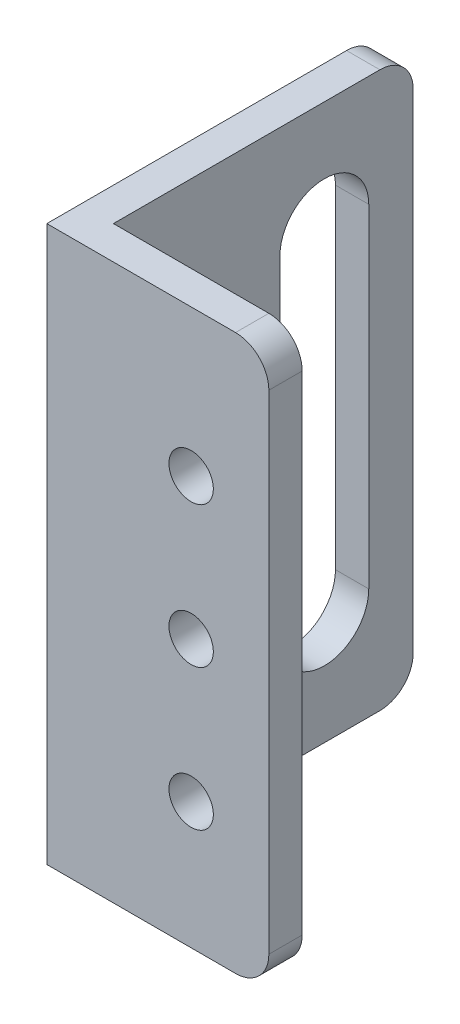
ISO-10303-21;
HEADER;
FILE_DESCRIPTION(('STEP AP214'),'2;1');
FILE_NAME('part.step','',(''),(''),'','','');
FILE_SCHEMA(('AUTOMOTIVE_DESIGN { 1 0 10303 214 1 1 1 1 }'));
ENDSEC;
DATA;
#1=APPLICATION_CONTEXT('core data for automotive mechanical design processes');
#2=APPLICATION_PROTOCOL_DEFINITION('international standard','automotive_design',2000,#1);
#3=PRODUCT_CONTEXT('',#1,'mechanical');
#4=PRODUCT('Part','Part','',(#3));
#5=PRODUCT_RELATED_PRODUCT_CATEGORY('part','',(#4));
#6=PRODUCT_DEFINITION_FORMATION('','',#4);
#7=PRODUCT_DEFINITION_CONTEXT('part definition',#1,'design');
#8=PRODUCT_DEFINITION('design','',#6,#7);
#9=PRODUCT_DEFINITION_SHAPE('','',#8);
#10=(LENGTH_UNIT() NAMED_UNIT(*) SI_UNIT(.MILLI.,.METRE.));
#11=(NAMED_UNIT(*) PLANE_ANGLE_UNIT() SI_UNIT($,.RADIAN.));
#12=(NAMED_UNIT(*) SI_UNIT($,.STERADIAN.) SOLID_ANGLE_UNIT());
#13=UNCERTAINTY_MEASURE_WITH_UNIT(LENGTH_MEASURE(1.E-05),#10,'distance_accuracy_value','');
#14=(GEOMETRIC_REPRESENTATION_CONTEXT(3) GLOBAL_UNCERTAINTY_ASSIGNED_CONTEXT((#13)) GLOBAL_UNIT_ASSIGNED_CONTEXT((#10,
#11,#12)) REPRESENTATION_CONTEXT('',''));
#15=CARTESIAN_POINT('',(0.,0.,0.));
#16=DIRECTION('',(0.,0.,1.));
#17=DIRECTION('',(1.,0.,0.));
#18=AXIS2_PLACEMENT_3D('',#15,#16,#17);
#19=CARTESIAN_POINT('',(-1.5,50.,0.));
#20=DIRECTION('',(1.,0.,0.));
#21=DIRECTION('',(0.,0.,-1.));
#22=AXIS2_PLACEMENT_3D('',#19,#20,#21);
#23=PLANE('',#22);
#24=DIRECTION('',(0.,-1.,0.));
#25=VECTOR('',#24,1.);
#26=CARTESIAN_POINT('',(-1.5,40.,-11.));
#27=LINE('',#26,#25);
#28=CARTESIAN_POINT('',(-1.5,40.,-11.));
#29=VERTEX_POINT('',#28);
#30=CARTESIAN_POINT('',(-1.5,10.,-11.));
#31=VERTEX_POINT('',#30);
#32=EDGE_CURVE('E159',#29,#31,#27,.T.);
#33=ORIENTED_EDGE('',*,*,#32,.F.);
#34=CARTESIAN_POINT('',(-1.5,40.,-7.));
#35=DIRECTION('',(-1.,0.,0.));
#36=DIRECTION('',(0.,0.,1.));
#37=AXIS2_PLACEMENT_3D('',#34,#35,#36);
#38=CIRCLE('',#37,4.);
#39=CARTESIAN_POINT('',(-1.5,40.,-3.));
#40=VERTEX_POINT('',#39);
#41=EDGE_CURVE('E164',#40,#29,#38,.T.);
#42=ORIENTED_EDGE('',*,*,#41,.F.);
#43=DIRECTION('',(0.,1.,0.));
#44=VECTOR('',#43,1.);
#45=CARTESIAN_POINT('',(-1.5,40.,-3.));
#46=LINE('',#45,#44);
#47=CARTESIAN_POINT('',(-1.5,10.,-3.));
#48=VERTEX_POINT('',#47);
#49=EDGE_CURVE('E167',#48,#40,#46,.T.);
#50=ORIENTED_EDGE('',*,*,#49,.F.);
#51=CARTESIAN_POINT('',(-1.5,10.,-7.));
#52=DIRECTION('',(-1.,0.,0.));
#53=DIRECTION('',(0.,0.,1.));
#54=AXIS2_PLACEMENT_3D('',#51,#52,#53);
#55=CIRCLE('',#54,4.);
#56=EDGE_CURVE('E148',#31,#48,#55,.T.);
#57=ORIENTED_EDGE('',*,*,#56,.F.);
#58=EDGE_LOOP('',(#33,#42,#50,#57));
#59=FACE_BOUND('',#58,.T.);
#60=DIRECTION('',(0.,0.,1.));
#61=VECTOR('',#60,1.);
#62=CARTESIAN_POINT('',(-1.5,50.,0.));
#63=LINE('',#62,#61);
#64=CARTESIAN_POINT('',(-1.5,50.,-12.));
#65=VERTEX_POINT('',#64);
#66=CARTESIAN_POINT('',(-1.5,50.,15.));
#67=VERTEX_POINT('',#66);
#68=EDGE_CURVE('E186',#65,#67,#63,.T.);
#69=ORIENTED_EDGE('',*,*,#68,.F.);
#70=CARTESIAN_POINT('',(-1.5,47.,-12.));
#71=DIRECTION('',(1.,0.,0.));
#72=DIRECTION('',(0.,0.,-1.));
#73=AXIS2_PLACEMENT_3D('',#70,#71,#72);
#74=CIRCLE('',#73,3.);
#75=CARTESIAN_POINT('',(-1.5,47.,-15.));
#76=VERTEX_POINT('',#75);
#77=EDGE_CURVE('E265',#65,#76,#74,.F.);
#78=ORIENTED_EDGE('',*,*,#77,.T.);
#79=DIRECTION('',(0.,-1.,0.));
#80=VECTOR('',#79,1.);
#81=CARTESIAN_POINT('',(-1.5,50.,-15.));
#82=LINE('',#81,#80);
#83=CARTESIAN_POINT('',(-1.5,3.,-15.));
#84=VERTEX_POINT('',#83);
#85=EDGE_CURVE('E197',#76,#84,#82,.T.);
#86=ORIENTED_EDGE('',*,*,#85,.T.);
#87=CARTESIAN_POINT('',(-1.5,3.,-12.));
#88=DIRECTION('',(1.,0.,0.));
#89=DIRECTION('',(0.,0.,-1.));
#90=AXIS2_PLACEMENT_3D('',#87,#88,#89);
#91=CIRCLE('',#90,3.);
#92=CARTESIAN_POINT('',(-1.5,0.,-12.));
#93=VERTEX_POINT('',#92);
#94=EDGE_CURVE('E56',#84,#93,#91,.F.);
#95=ORIENTED_EDGE('',*,*,#94,.T.);
#96=DIRECTION('',(0.,0.,1.));
#97=VECTOR('',#96,1.);
#98=CARTESIAN_POINT('',(-1.5,0.,0.));
#99=LINE('',#98,#97);
#100=CARTESIAN_POINT('',(-1.5,0.,15.));
#101=VERTEX_POINT('',#100);
#102=EDGE_CURVE('E198',#93,#101,#99,.T.);
#103=ORIENTED_EDGE('',*,*,#102,.T.);
#104=DIRECTION('',(0.,-1.,0.));
#105=VECTOR('',#104,1.);
#106=CARTESIAN_POINT('',(-1.5,50.,15.));
#107=LINE('',#106,#105);
#108=EDGE_CURVE('E221',#67,#101,#107,.T.);
#109=ORIENTED_EDGE('',*,*,#108,.F.);
#110=EDGE_LOOP('',(#69,#78,#86,#95,#103,#109));
#111=FACE_BOUND('',#110,.T.);
#112=ADVANCED_FACE('F41',(#59,#111),#23,.F.);
#113=CARTESIAN_POINT('',(0.,50.,15.));
#114=DIRECTION('',(0.,0.,-1.));
#115=DIRECTION('',(-1.,0.,0.));
#116=AXIS2_PLACEMENT_3D('',#113,#114,#115);
#117=PLANE('',#116);
#118=CARTESIAN_POINT('',(11.5,36.8,15.));
#119=DIRECTION('',(0.,0.,1.));
#120=DIRECTION('',(1.,0.,0.));
#121=AXIS2_PLACEMENT_3D('',#118,#119,#120);
#122=CIRCLE('',#121,2.);
#123=CARTESIAN_POINT('',(13.5,36.8,15.));
#124=VERTEX_POINT('',#123);
#125=EDGE_CURVE('E177',#124,#124,#122,.T.);
#126=ORIENTED_EDGE('',*,*,#125,.F.);
#127=EDGE_LOOP('',(#126));
#128=FACE_BOUND('',#127,.T.);
#129=CARTESIAN_POINT('',(11.5000000000001,24.1,15.));
#130=DIRECTION('',(0.,0.,1.));
#131=DIRECTION('',(1.,0.,0.));
#132=AXIS2_PLACEMENT_3D('',#129,#130,#131);
#133=CIRCLE('',#132,2.);
#134=CARTESIAN_POINT('',(13.5000000000001,24.1,15.));
#135=VERTEX_POINT('',#134);
#136=EDGE_CURVE('E181',#135,#135,#133,.T.);
#137=ORIENTED_EDGE('',*,*,#136,.F.);
#138=EDGE_LOOP('',(#137));
#139=FACE_BOUND('',#138,.T.);
#140=CARTESIAN_POINT('',(11.5000000000003,11.4,15.));
#141=DIRECTION('',(0.,0.,1.));
#142=DIRECTION('',(1.,0.,0.));
#143=AXIS2_PLACEMENT_3D('',#140,#141,#142);
#144=CIRCLE('',#143,2.);
#145=CARTESIAN_POINT('',(13.5000000000003,11.4,15.));
#146=VERTEX_POINT('',#145);
#147=EDGE_CURVE('E174',#146,#146,#144,.T.);
#148=ORIENTED_EDGE('',*,*,#147,.F.);
#149=EDGE_LOOP('',(#148));
#150=FACE_BOUND('',#149,.T.);
#151=DIRECTION('',(0.,-1.,0.));
#152=VECTOR('',#151,1.);
#153=CARTESIAN_POINT('',(18.5,50.,15.));
#154=LINE('',#153,#152);
#155=CARTESIAN_POINT('',(18.5,47.,15.));
#156=VERTEX_POINT('',#155);
#157=CARTESIAN_POINT('',(18.5,3.,15.));
#158=VERTEX_POINT('',#157);
#159=EDGE_CURVE('E218',#156,#158,#154,.T.);
#160=ORIENTED_EDGE('',*,*,#159,.F.);
#161=CARTESIAN_POINT('',(15.5,47.,15.));
#162=DIRECTION('',(0.,0.,-1.));
#163=DIRECTION('',(-1.,0.,0.));
#164=AXIS2_PLACEMENT_3D('',#161,#162,#163);
#165=CIRCLE('',#164,3.);
#166=CARTESIAN_POINT('',(15.5,50.,15.));
#167=VERTEX_POINT('',#166);
#168=EDGE_CURVE('E254',#156,#167,#165,.F.);
#169=ORIENTED_EDGE('',*,*,#168,.T.);
#170=DIRECTION('',(1.,0.,0.));
#171=VECTOR('',#170,1.);
#172=CARTESIAN_POINT('',(0.,50.,15.));
#173=LINE('',#172,#171);
#174=EDGE_CURVE('E188',#67,#167,#173,.T.);
#175=ORIENTED_EDGE('',*,*,#174,.F.);
#176=ORIENTED_EDGE('',*,*,#108,.T.);
#177=DIRECTION('',(1.,0.,0.));
#178=VECTOR('',#177,1.);
#179=CARTESIAN_POINT('',(0.,0.,15.));
#180=LINE('',#179,#178);
#181=CARTESIAN_POINT('',(15.5,0.,15.));
#182=VERTEX_POINT('',#181);
#183=EDGE_CURVE('E200',#101,#182,#180,.T.);
#184=ORIENTED_EDGE('',*,*,#183,.T.);
#185=CARTESIAN_POINT('',(15.5,3.,15.));
#186=DIRECTION('',(0.,0.,-1.));
#187=DIRECTION('',(-1.,0.,0.));
#188=AXIS2_PLACEMENT_3D('',#185,#186,#187);
#189=CIRCLE('',#188,3.);
#190=EDGE_CURVE('E252',#182,#158,#189,.F.);
#191=ORIENTED_EDGE('',*,*,#190,.T.);
#192=EDGE_LOOP('',(#160,#169,#175,#176,#184,#191));
#193=FACE_BOUND('',#192,.T.);
#194=ADVANCED_FACE('F275',(#128,#139,#150,#193),#117,.F.);
#195=CARTESIAN_POINT('',(18.5,50.,0.));
#196=DIRECTION('',(-1.,0.,0.));
#197=DIRECTION('',(0.,0.,1.));
#198=AXIS2_PLACEMENT_3D('',#195,#196,#197);
#199=PLANE('',#198);
#200=DIRECTION('',(0.,-1.,0.));
#201=VECTOR('',#200,1.);
#202=CARTESIAN_POINT('',(18.5,50.,12.));
#203=LINE('',#202,#201);
#204=CARTESIAN_POINT('',(18.5,47.,12.));
#205=VERTEX_POINT('',#204);
#206=CARTESIAN_POINT('',(18.5,3.,12.));
#207=VERTEX_POINT('',#206);
#208=EDGE_CURVE('E215',#205,#207,#203,.T.);
#209=ORIENTED_EDGE('',*,*,#208,.F.);
#210=DIRECTION('',(0.,0.,-1.));
#211=VECTOR('',#210,1.);
#212=CARTESIAN_POINT('',(18.5,47.,15.));
#213=LINE('',#212,#211);
#214=EDGE_CURVE('E250',#205,#156,#213,.F.);
#215=ORIENTED_EDGE('',*,*,#214,.T.);
#216=ORIENTED_EDGE('',*,*,#159,.T.);
#217=DIRECTION('',(0.,0.,-1.));
#218=VECTOR('',#217,1.);
#219=CARTESIAN_POINT('',(18.5,3.,0.));
#220=LINE('',#219,#218);
#221=EDGE_CURVE('E247',#158,#207,#220,.T.);
#222=ORIENTED_EDGE('',*,*,#221,.T.);
#223=EDGE_LOOP('',(#209,#215,#216,#222));
#224=FACE_BOUND('',#223,.T.);
#225=ADVANCED_FACE('F281',(#224),#199,.F.);
#226=CARTESIAN_POINT('',(0.,50.,12.));
#227=DIRECTION('',(0.,0.,-1.));
#228=DIRECTION('',(-1.,0.,0.));
#229=AXIS2_PLACEMENT_3D('',#226,#227,#228);
#230=PLANE('',#229);
#231=CARTESIAN_POINT('',(11.5,36.8,12.));
#232=DIRECTION('',(0.,0.,-1.));
#233=DIRECTION('',(-1.,0.,0.));
#234=AXIS2_PLACEMENT_3D('',#231,#232,#233);
#235=CIRCLE('',#234,2.);
#236=CARTESIAN_POINT('',(9.50000000000001,36.8,12.));
#237=VERTEX_POINT('',#236);
#238=EDGE_CURVE('E201',#237,#237,#235,.T.);
#239=ORIENTED_EDGE('',*,*,#238,.F.);
#240=EDGE_LOOP('',(#239));
#241=FACE_BOUND('',#240,.T.);
#242=CARTESIAN_POINT('',(11.5000000000001,24.1,12.));
#243=DIRECTION('',(0.,0.,-1.));
#244=DIRECTION('',(-1.,0.,0.));
#245=AXIS2_PLACEMENT_3D('',#242,#243,#244);
#246=CIRCLE('',#245,2.);
#247=CARTESIAN_POINT('',(9.50000000000014,24.1,12.));
#248=VERTEX_POINT('',#247);
#249=EDGE_CURVE('E227',#248,#248,#246,.T.);
#250=ORIENTED_EDGE('',*,*,#249,.F.);
#251=EDGE_LOOP('',(#250));
#252=FACE_BOUND('',#251,.T.);
#253=CARTESIAN_POINT('',(11.5000000000003,11.4,12.));
#254=DIRECTION('',(0.,0.,-1.));
#255=DIRECTION('',(-1.,0.,0.));
#256=AXIS2_PLACEMENT_3D('',#253,#254,#255);
#257=CIRCLE('',#256,2.);
#258=CARTESIAN_POINT('',(9.50000000000027,11.4,12.));
#259=VERTEX_POINT('',#258);
#260=EDGE_CURVE('E180',#259,#259,#257,.T.);
#261=ORIENTED_EDGE('',*,*,#260,.F.);
#262=EDGE_LOOP('',(#261));
#263=FACE_BOUND('',#262,.T.);
#264=DIRECTION('',(1.,0.,0.));
#265=VECTOR('',#264,1.);
#266=CARTESIAN_POINT('',(0.,50.,12.));
#267=LINE('',#266,#265);
#268=CARTESIAN_POINT('',(1.5,50.,12.));
#269=VERTEX_POINT('',#268);
#270=CARTESIAN_POINT('',(15.5,50.,12.));
#271=VERTEX_POINT('',#270);
#272=EDGE_CURVE('E192',#269,#271,#267,.T.);
#273=ORIENTED_EDGE('',*,*,#272,.T.);
#274=CARTESIAN_POINT('',(15.5,47.,12.));
#275=DIRECTION('',(0.,0.,-1.));
#276=DIRECTION('',(-1.,0.,0.));
#277=AXIS2_PLACEMENT_3D('',#274,#275,#276);
#278=CIRCLE('',#277,3.);
#279=EDGE_CURVE('E245',#271,#205,#278,.T.);
#280=ORIENTED_EDGE('',*,*,#279,.T.);
#281=ORIENTED_EDGE('',*,*,#208,.T.);
#282=CARTESIAN_POINT('',(15.5,3.,12.));
#283=DIRECTION('',(0.,0.,-1.));
#284=DIRECTION('',(-1.,0.,0.));
#285=AXIS2_PLACEMENT_3D('',#282,#283,#284);
#286=CIRCLE('',#285,3.);
#287=CARTESIAN_POINT('',(15.5,0.,12.));
#288=VERTEX_POINT('',#287);
#289=EDGE_CURVE('E243',#207,#288,#286,.T.);
#290=ORIENTED_EDGE('',*,*,#289,.T.);
#291=DIRECTION('',(1.,0.,0.));
#292=VECTOR('',#291,1.);
#293=CARTESIAN_POINT('',(0.,0.,12.));
#294=LINE('',#293,#292);
#295=CARTESIAN_POINT('',(1.5,0.,12.));
#296=VERTEX_POINT('',#295);
#297=EDGE_CURVE('E204',#296,#288,#294,.T.);
#298=ORIENTED_EDGE('',*,*,#297,.F.);
#299=DIRECTION('',(0.,-1.,0.));
#300=VECTOR('',#299,1.);
#301=CARTESIAN_POINT('',(1.5,50.,12.));
#302=LINE('',#301,#300);
#303=EDGE_CURVE('E212',#269,#296,#302,.T.);
#304=ORIENTED_EDGE('',*,*,#303,.F.);
#305=EDGE_LOOP('',(#273,#280,#281,#290,#298,#304));
#306=FACE_BOUND('',#305,.T.);
#307=ADVANCED_FACE('F284',(#241,#252,#263,#306),#230,.T.);
#308=CARTESIAN_POINT('',(1.5,50.,0.));
#309=DIRECTION('',(1.,0.,0.));
#310=DIRECTION('',(0.,0.,-1.));
#311=AXIS2_PLACEMENT_3D('',#308,#309,#310);
#312=PLANE('',#311);
#313=CARTESIAN_POINT('',(1.5,40.,-7.));
#314=DIRECTION('',(1.,0.,0.));
#315=DIRECTION('',(0.,0.,-1.));
#316=AXIS2_PLACEMENT_3D('',#313,#314,#315);
#317=CIRCLE('',#316,4.);
#318=CARTESIAN_POINT('',(1.5,40.,-11.));
#319=VERTEX_POINT('',#318);
#320=CARTESIAN_POINT('',(1.5,40.,-3.));
#321=VERTEX_POINT('',#320);
#322=EDGE_CURVE('E236',#319,#321,#317,.T.);
#323=ORIENTED_EDGE('',*,*,#322,.F.);
#324=DIRECTION('',(0.,1.,0.));
#325=VECTOR('',#324,1.);
#326=CARTESIAN_POINT('',(1.5,50.,-11.));
#327=LINE('',#326,#325);
#328=CARTESIAN_POINT('',(1.5,10.,-11.));
#329=VERTEX_POINT('',#328);
#330=EDGE_CURVE('E224',#329,#319,#327,.T.);
#331=ORIENTED_EDGE('',*,*,#330,.F.);
#332=CARTESIAN_POINT('',(1.5,10.,-7.));
#333=DIRECTION('',(1.,0.,0.));
#334=DIRECTION('',(0.,0.,-1.));
#335=AXIS2_PLACEMENT_3D('',#332,#333,#334);
#336=CIRCLE('',#335,4.);
#337=CARTESIAN_POINT('',(1.5,10.,-3.));
#338=VERTEX_POINT('',#337);
#339=EDGE_CURVE('E151',#338,#329,#336,.T.);
#340=ORIENTED_EDGE('',*,*,#339,.F.);
#341=DIRECTION('',(0.,-1.,0.));
#342=VECTOR('',#341,1.);
#343=CARTESIAN_POINT('',(1.5,50.,-3.));
#344=LINE('',#343,#342);
#345=EDGE_CURVE('E234',#321,#338,#344,.T.);
#346=ORIENTED_EDGE('',*,*,#345,.F.);
#347=EDGE_LOOP('',(#323,#331,#340,#346));
#348=FACE_BOUND('',#347,.T.);
#349=DIRECTION('',(0.,-1.,0.));
#350=VECTOR('',#349,1.);
#351=CARTESIAN_POINT('',(1.5,50.,-15.));
#352=LINE('',#351,#350);
#353=CARTESIAN_POINT('',(1.5,47.,-15.));
#354=VERTEX_POINT('',#353);
#355=CARTESIAN_POINT('',(1.5,3.,-15.));
#356=VERTEX_POINT('',#355);
#357=EDGE_CURVE('E209',#354,#356,#352,.T.);
#358=ORIENTED_EDGE('',*,*,#357,.F.);
#359=CARTESIAN_POINT('',(1.5,47.,-12.));
#360=DIRECTION('',(1.,0.,0.));
#361=DIRECTION('',(0.,0.,-1.));
#362=AXIS2_PLACEMENT_3D('',#359,#360,#361);
#363=CIRCLE('',#362,3.);
#364=CARTESIAN_POINT('',(1.5,50.,-12.));
#365=VERTEX_POINT('',#364);
#366=EDGE_CURVE('E262',#354,#365,#363,.T.);
#367=ORIENTED_EDGE('',*,*,#366,.T.);
#368=DIRECTION('',(0.,0.,1.));
#369=VECTOR('',#368,1.);
#370=CARTESIAN_POINT('',(1.5,50.,0.));
#371=LINE('',#370,#369);
#372=EDGE_CURVE('E195',#365,#269,#371,.T.);
#373=ORIENTED_EDGE('',*,*,#372,.T.);
#374=ORIENTED_EDGE('',*,*,#303,.T.);
#375=DIRECTION('',(0.,0.,1.));
#376=VECTOR('',#375,1.);
#377=CARTESIAN_POINT('',(1.5,0.,0.));
#378=LINE('',#377,#376);
#379=CARTESIAN_POINT('',(1.5,0.,-12.));
#380=VERTEX_POINT('',#379);
#381=EDGE_CURVE('E189',#380,#296,#378,.T.);
#382=ORIENTED_EDGE('',*,*,#381,.F.);
#383=CARTESIAN_POINT('',(1.5,3.,-12.));
#384=DIRECTION('',(1.,0.,0.));
#385=DIRECTION('',(0.,0.,-1.));
#386=AXIS2_PLACEMENT_3D('',#383,#384,#385);
#387=CIRCLE('',#386,3.);
#388=EDGE_CURVE('E64',#380,#356,#387,.T.);
#389=ORIENTED_EDGE('',*,*,#388,.T.);
#390=EDGE_LOOP('',(#358,#367,#373,#374,#382,#389));
#391=FACE_BOUND('',#390,.T.);
#392=ADVANCED_FACE('F307',(#348,#391),#312,.T.);
#393=CARTESIAN_POINT('',(0.,50.,-15.));
#394=DIRECTION('',(0.,0.,-1.));
#395=DIRECTION('',(-1.,0.,0.));
#396=AXIS2_PLACEMENT_3D('',#393,#394,#395);
#397=PLANE('',#396);
#398=ORIENTED_EDGE('',*,*,#85,.F.);
#399=DIRECTION('',(1.,0.,0.));
#400=VECTOR('',#399,1.);
#401=CARTESIAN_POINT('',(0.,47.,-15.));
#402=LINE('',#401,#400);
#403=EDGE_CURVE('E258',#76,#354,#402,.T.);
#404=ORIENTED_EDGE('',*,*,#403,.T.);
#405=ORIENTED_EDGE('',*,*,#357,.T.);
#406=DIRECTION('',(1.,0.,0.));
#407=VECTOR('',#406,1.);
#408=CARTESIAN_POINT('',(-1.5,3.,-15.));
#409=LINE('',#408,#407);
#410=EDGE_CURVE('E256',#356,#84,#409,.F.);
#411=ORIENTED_EDGE('',*,*,#410,.T.);
#412=EDGE_LOOP('',(#398,#404,#405,#411));
#413=FACE_BOUND('',#412,.T.);
#414=ADVANCED_FACE('F300',(#413),#397,.T.);
#415=CARTESIAN_POINT('',(0.,50.,0.));
#416=DIRECTION('',(0.,1.,0.));
#417=DIRECTION('',(0.,0.,1.));
#418=AXIS2_PLACEMENT_3D('',#415,#416,#417);
#419=PLANE('',#418);
#420=ORIENTED_EDGE('',*,*,#174,.T.);
#421=DIRECTION('',(0.,0.,-1.));
#422=VECTOR('',#421,1.);
#423=CARTESIAN_POINT('',(15.5,50.,12.));
#424=LINE('',#423,#422);
#425=EDGE_CURVE('E240',#167,#271,#424,.T.);
#426=ORIENTED_EDGE('',*,*,#425,.T.);
#427=ORIENTED_EDGE('',*,*,#272,.F.);
#428=ORIENTED_EDGE('',*,*,#372,.F.);
#429=DIRECTION('',(1.,0.,0.));
#430=VECTOR('',#429,1.);
#431=CARTESIAN_POINT('',(0.,50.,-12.));
#432=LINE('',#431,#430);
#433=EDGE_CURVE('E238',#365,#65,#432,.F.);
#434=ORIENTED_EDGE('',*,*,#433,.T.);
#435=ORIENTED_EDGE('',*,*,#68,.T.);
#436=EDGE_LOOP('',(#420,#426,#427,#428,#434,#435));
#437=FACE_BOUND('',#436,.T.);
#438=ADVANCED_FACE('F292',(#437),#419,.T.);
#439=CARTESIAN_POINT('',(0.,0.,0.));
#440=DIRECTION('',(0.,1.,0.));
#441=DIRECTION('',(0.,0.,1.));
#442=AXIS2_PLACEMENT_3D('',#439,#440,#441);
#443=PLANE('',#442);
#444=ORIENTED_EDGE('',*,*,#102,.F.);
#445=DIRECTION('',(1.,0.,0.));
#446=VECTOR('',#445,1.);
#447=CARTESIAN_POINT('',(1.5,0.,-12.));
#448=LINE('',#447,#446);
#449=EDGE_CURVE('E11',#93,#380,#448,.T.);
#450=ORIENTED_EDGE('',*,*,#449,.T.);
#451=ORIENTED_EDGE('',*,*,#381,.T.);
#452=ORIENTED_EDGE('',*,*,#297,.T.);
#453=DIRECTION('',(0.,0.,-1.));
#454=VECTOR('',#453,1.);
#455=CARTESIAN_POINT('',(15.5,0.,0.));
#456=LINE('',#455,#454);
#457=EDGE_CURVE('E49',#288,#182,#456,.F.);
#458=ORIENTED_EDGE('',*,*,#457,.T.);
#459=ORIENTED_EDGE('',*,*,#183,.F.);
#460=EDGE_LOOP('',(#444,#450,#451,#452,#458,#459));
#461=FACE_BOUND('',#460,.T.);
#462=ADVANCED_FACE('F269',(#461),#443,.F.);
#463=CARTESIAN_POINT('',(11.5000000000003,11.4,5.));
#464=DIRECTION('',(0.,0.,1.));
#465=DIRECTION('',(1.,0.,0.));
#466=AXIS2_PLACEMENT_3D('',#463,#464,#465);
#467=CYLINDRICAL_SURFACE('',#466,2.);
#468=ORIENTED_EDGE('',*,*,#260,.T.);
#469=EDGE_LOOP('',(#468));
#470=FACE_BOUND('',#469,.T.);
#471=ORIENTED_EDGE('',*,*,#147,.T.);
#472=EDGE_LOOP('',(#471));
#473=FACE_BOUND('',#472,.T.);
#474=ADVANCED_FACE('F411',(#470,#473),#467,.F.);
#475=CARTESIAN_POINT('',(11.5000000000001,24.1,5.));
#476=DIRECTION('',(0.,0.,1.));
#477=DIRECTION('',(1.,0.,0.));
#478=AXIS2_PLACEMENT_3D('',#475,#476,#477);
#479=CYLINDRICAL_SURFACE('',#478,2.);
#480=ORIENTED_EDGE('',*,*,#249,.T.);
#481=EDGE_LOOP('',(#480));
#482=FACE_BOUND('',#481,.T.);
#483=ORIENTED_EDGE('',*,*,#136,.T.);
#484=EDGE_LOOP('',(#483));
#485=FACE_BOUND('',#484,.T.);
#486=ADVANCED_FACE('F401',(#482,#485),#479,.F.);
#487=CARTESIAN_POINT('',(11.5,36.8,5.));
#488=DIRECTION('',(0.,0.,1.));
#489=DIRECTION('',(1.,0.,0.));
#490=AXIS2_PLACEMENT_3D('',#487,#488,#489);
#491=CYLINDRICAL_SURFACE('',#490,2.);
#492=ORIENTED_EDGE('',*,*,#238,.T.);
#493=EDGE_LOOP('',(#492));
#494=FACE_BOUND('',#493,.T.);
#495=ORIENTED_EDGE('',*,*,#125,.T.);
#496=EDGE_LOOP('',(#495));
#497=FACE_BOUND('',#496,.T.);
#498=ADVANCED_FACE('F391',(#494,#497),#491,.F.);
#499=CARTESIAN_POINT('',(8.5,40.,-7.));
#500=DIRECTION('',(-1.,0.,0.));
#501=DIRECTION('',(0.,0.,1.));
#502=AXIS2_PLACEMENT_3D('',#499,#500,#501);
#503=CYLINDRICAL_SURFACE('',#502,4.);
#504=ORIENTED_EDGE('',*,*,#322,.T.);
#505=DIRECTION('',(-1.,0.,0.));
#506=VECTOR('',#505,1.);
#507=CARTESIAN_POINT('',(8.5,40.,-3.));
#508=LINE('',#507,#506);
#509=EDGE_CURVE('E172',#321,#40,#508,.T.);
#510=ORIENTED_EDGE('',*,*,#509,.T.);
#511=ORIENTED_EDGE('',*,*,#41,.T.);
#512=DIRECTION('',(-1.,0.,0.));
#513=VECTOR('',#512,1.);
#514=CARTESIAN_POINT('',(8.5,40.,-11.));
#515=LINE('',#514,#513);
#516=EDGE_CURVE('E155',#319,#29,#515,.T.);
#517=ORIENTED_EDGE('',*,*,#516,.F.);
#518=EDGE_LOOP('',(#504,#510,#511,#517));
#519=FACE_BOUND('',#518,.T.);
#520=ADVANCED_FACE('F381',(#519),#503,.F.);
#521=CARTESIAN_POINT('',(8.5,40.,-3.));
#522=DIRECTION('',(0.,0.,1.));
#523=DIRECTION('',(1.,0.,0.));
#524=AXIS2_PLACEMENT_3D('',#521,#522,#523);
#525=PLANE('',#524);
#526=ORIENTED_EDGE('',*,*,#345,.T.);
#527=DIRECTION('',(-1.,0.,0.));
#528=VECTOR('',#527,1.);
#529=CARTESIAN_POINT('',(8.5,10.,-3.));
#530=LINE('',#529,#528);
#531=EDGE_CURVE('E154',#338,#48,#530,.T.);
#532=ORIENTED_EDGE('',*,*,#531,.T.);
#533=ORIENTED_EDGE('',*,*,#49,.T.);
#534=ORIENTED_EDGE('',*,*,#509,.F.);
#535=EDGE_LOOP('',(#526,#532,#533,#534));
#536=FACE_BOUND('',#535,.T.);
#537=ADVANCED_FACE('F372',(#536),#525,.F.);
#538=CARTESIAN_POINT('',(8.5,10.,-7.));
#539=DIRECTION('',(-1.,0.,0.));
#540=DIRECTION('',(0.,0.,1.));
#541=AXIS2_PLACEMENT_3D('',#538,#539,#540);
#542=CYLINDRICAL_SURFACE('',#541,4.);
#543=ORIENTED_EDGE('',*,*,#339,.T.);
#544=DIRECTION('',(-1.,0.,0.));
#545=VECTOR('',#544,1.);
#546=CARTESIAN_POINT('',(8.5,10.,-11.));
#547=LINE('',#546,#545);
#548=EDGE_CURVE('E143',#329,#31,#547,.T.);
#549=ORIENTED_EDGE('',*,*,#548,.T.);
#550=ORIENTED_EDGE('',*,*,#56,.T.);
#551=ORIENTED_EDGE('',*,*,#531,.F.);
#552=EDGE_LOOP('',(#543,#549,#550,#551));
#553=FACE_BOUND('',#552,.T.);
#554=ADVANCED_FACE('F145',(#553),#542,.F.);
#555=CARTESIAN_POINT('',(8.5,40.,-11.));
#556=DIRECTION('',(0.,0.,-1.));
#557=DIRECTION('',(-1.,0.,0.));
#558=AXIS2_PLACEMENT_3D('',#555,#556,#557);
#559=PLANE('',#558);
#560=ORIENTED_EDGE('',*,*,#330,.T.);
#561=ORIENTED_EDGE('',*,*,#516,.T.);
#562=ORIENTED_EDGE('',*,*,#32,.T.);
#563=ORIENTED_EDGE('',*,*,#548,.F.);
#564=EDGE_LOOP('',(#560,#561,#562,#563));
#565=FACE_BOUND('',#564,.T.);
#566=ADVANCED_FACE('F160',(#565),#559,.F.);
#567=CARTESIAN_POINT('',(15.5,47.,0.));
#568=DIRECTION('',(0.,0.,1.));
#569=DIRECTION('',(1.,0.,0.));
#570=AXIS2_PLACEMENT_3D('',#567,#568,#569);
#571=CYLINDRICAL_SURFACE('',#570,3.);
#572=ORIENTED_EDGE('',*,*,#168,.F.);
#573=ORIENTED_EDGE('',*,*,#214,.F.);
#574=ORIENTED_EDGE('',*,*,#279,.F.);
#575=ORIENTED_EDGE('',*,*,#425,.F.);
#576=EDGE_LOOP('',(#572,#573,#574,#575));
#577=FACE_BOUND('',#576,.T.);
#578=ADVANCED_FACE('F290',(#577),#571,.T.);
#579=CARTESIAN_POINT('',(0.,47.,-12.));
#580=DIRECTION('',(1.,0.,0.));
#581=DIRECTION('',(0.,0.,-1.));
#582=AXIS2_PLACEMENT_3D('',#579,#580,#581);
#583=CYLINDRICAL_SURFACE('',#582,3.);
#584=ORIENTED_EDGE('',*,*,#77,.F.);
#585=ORIENTED_EDGE('',*,*,#433,.F.);
#586=ORIENTED_EDGE('',*,*,#366,.F.);
#587=ORIENTED_EDGE('',*,*,#403,.F.);
#588=EDGE_LOOP('',(#584,#585,#586,#587));
#589=FACE_BOUND('',#588,.T.);
#590=ADVANCED_FACE('F305',(#589),#583,.T.);
#591=CARTESIAN_POINT('',(0.,3.,-12.));
#592=DIRECTION('',(-1.,0.,0.));
#593=DIRECTION('',(0.,0.,1.));
#594=AXIS2_PLACEMENT_3D('',#591,#592,#593);
#595=CYLINDRICAL_SURFACE('',#594,3.);
#596=ORIENTED_EDGE('',*,*,#94,.F.);
#597=ORIENTED_EDGE('',*,*,#410,.F.);
#598=ORIENTED_EDGE('',*,*,#388,.F.);
#599=ORIENTED_EDGE('',*,*,#449,.F.);
#600=EDGE_LOOP('',(#596,#597,#598,#599));
#601=FACE_BOUND('',#600,.T.);
#602=ADVANCED_FACE('F297',(#601),#595,.T.);
#603=CARTESIAN_POINT('',(15.5,3.,0.));
#604=DIRECTION('',(0.,0.,-1.));
#605=DIRECTION('',(-1.,0.,0.));
#606=AXIS2_PLACEMENT_3D('',#603,#604,#605);
#607=CYLINDRICAL_SURFACE('',#606,3.);
#608=ORIENTED_EDGE('',*,*,#190,.F.);
#609=ORIENTED_EDGE('',*,*,#457,.F.);
#610=ORIENTED_EDGE('',*,*,#289,.F.);
#611=ORIENTED_EDGE('',*,*,#221,.F.);
#612=EDGE_LOOP('',(#608,#609,#610,#611));
#613=FACE_BOUND('',#612,.T.);
#614=ADVANCED_FACE('F43',(#613),#607,.T.);
#615=CLOSED_SHELL('',(#112,#194,#225,#307,#392,#414,#438,#462,#474,#486,#498,#520,#537,#554,
#566,#578,#590,#602,#614));
#616=MANIFOLD_SOLID_BREP('B2',#615);
#617=ADVANCED_BREP_SHAPE_REPRESENTATION('',(#18,#616),#14);
#618=SHAPE_DEFINITION_REPRESENTATION(#9,#617);
ENDSEC;
END-ISO-10303-21;
